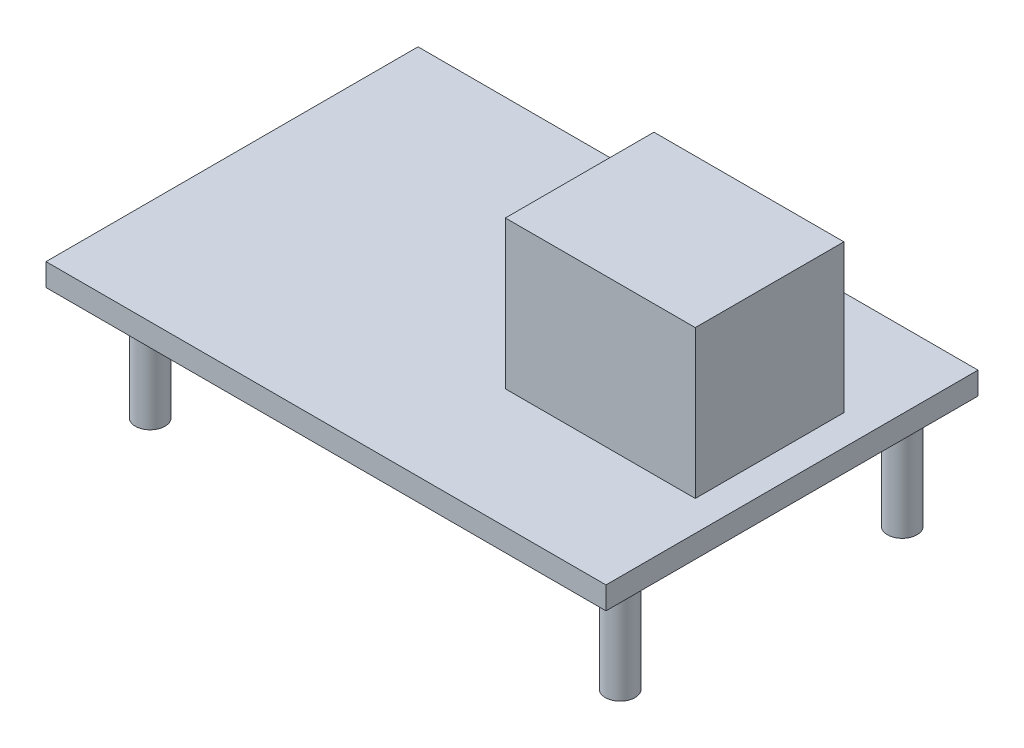
ISO-10303-21;
HEADER;
FILE_DESCRIPTION(('STEP AP214'),'2;1');
FILE_NAME('part.step','',(''),(''),'','','');
FILE_SCHEMA(('AUTOMOTIVE_DESIGN { 1 0 10303 214 1 1 1 1 }'));
ENDSEC;
DATA;
#1=APPLICATION_CONTEXT('core data for automotive mechanical design processes');
#2=APPLICATION_PROTOCOL_DEFINITION('international standard','automotive_design',2000,#1);
#3=PRODUCT_CONTEXT('',#1,'mechanical');
#4=PRODUCT('Part','Part','',(#3));
#5=PRODUCT_RELATED_PRODUCT_CATEGORY('part','',(#4));
#6=PRODUCT_DEFINITION_FORMATION('','',#4);
#7=PRODUCT_DEFINITION_CONTEXT('part definition',#1,'design');
#8=PRODUCT_DEFINITION('design','',#6,#7);
#9=PRODUCT_DEFINITION_SHAPE('','',#8);
#10=(LENGTH_UNIT() NAMED_UNIT(*) SI_UNIT(.MILLI.,.METRE.));
#11=(NAMED_UNIT(*) PLANE_ANGLE_UNIT() SI_UNIT($,.RADIAN.));
#12=(NAMED_UNIT(*) SI_UNIT($,.STERADIAN.) SOLID_ANGLE_UNIT());
#13=UNCERTAINTY_MEASURE_WITH_UNIT(LENGTH_MEASURE(1.E-05),#10,'distance_accuracy_value','');
#14=(GEOMETRIC_REPRESENTATION_CONTEXT(3) GLOBAL_UNCERTAINTY_ASSIGNED_CONTEXT((#13)) GLOBAL_UNIT_ASSIGNED_CONTEXT((#10,
#11,#12)) REPRESENTATION_CONTEXT('',''));
#15=CARTESIAN_POINT('',(0.,0.,0.));
#16=DIRECTION('',(0.,0.,1.));
#17=DIRECTION('',(1.,0.,0.));
#18=AXIS2_PLACEMENT_3D('',#15,#16,#17);
#19=CARTESIAN_POINT('',(0.,0.76,0.));
#20=DIRECTION('',(0.,1.,0.));
#21=DIRECTION('',(0.,0.,1.));
#22=AXIS2_PLACEMENT_3D('',#19,#20,#21);
#23=PLANE('',#22);
#24=DIRECTION('',(0.,0.,1.));
#25=VECTOR('',#24,1.);
#26=CARTESIAN_POINT('',(0.,0.76,0.));
#27=LINE('',#26,#25);
#28=CARTESIAN_POINT('',(0.,0.76,0.));
#29=VERTEX_POINT('',#28);
#30=CARTESIAN_POINT('',(0.,0.76,12.57));
#31=VERTEX_POINT('',#30);
#32=EDGE_CURVE('E155',#29,#31,#27,.T.);
#33=ORIENTED_EDGE('',*,*,#32,.T.);
#34=DIRECTION('',(1.,0.,0.));
#35=VECTOR('',#34,1.);
#36=CARTESIAN_POINT('',(0.,0.76,12.57));
#37=LINE('',#36,#35);
#38=CARTESIAN_POINT('',(18.92,0.76,12.57));
#39=VERTEX_POINT('',#38);
#40=EDGE_CURVE('E88',#31,#39,#37,.T.);
#41=ORIENTED_EDGE('',*,*,#40,.T.);
#42=DIRECTION('',(0.,0.,-1.));
#43=VECTOR('',#42,1.);
#44=CARTESIAN_POINT('',(18.92,0.76,0.));
#45=LINE('',#44,#43);
#46=CARTESIAN_POINT('',(18.92,0.76,0.));
#47=VERTEX_POINT('',#46);
#48=EDGE_CURVE('E158',#39,#47,#45,.T.);
#49=ORIENTED_EDGE('',*,*,#48,.T.);
#50=DIRECTION('',(-1.,0.,0.));
#51=VECTOR('',#50,1.);
#52=CARTESIAN_POINT('',(0.,0.76,0.));
#53=LINE('',#52,#51);
#54=EDGE_CURVE('E59',#47,#29,#53,.T.);
#55=ORIENTED_EDGE('',*,*,#54,.T.);
#56=EDGE_LOOP('',(#33,#41,#49,#55));
#57=FACE_BOUND('',#56,.T.);
#58=DIRECTION('',(-1.,0.,0.));
#59=VECTOR('',#58,1.);
#60=CARTESIAN_POINT('',(17.9,0.76,3.51216856732342));
#61=LINE('',#60,#59);
#62=CARTESIAN_POINT('',(17.9,0.76,3.51216856732342));
#63=VERTEX_POINT('',#62);
#64=CARTESIAN_POINT('',(11.483680484199,0.76,3.51216856732342));
#65=VERTEX_POINT('',#64);
#66=EDGE_CURVE('E405',#63,#65,#61,.T.);
#67=ORIENTED_EDGE('',*,*,#66,.F.);
#68=DIRECTION('',(0.,0.,-1.));
#69=VECTOR('',#68,1.);
#70=CARTESIAN_POINT('',(17.9,0.76,3.51216856732342));
#71=LINE('',#70,#69);
#72=CARTESIAN_POINT('',(17.9,0.76,8.53245284543258));
#73=VERTEX_POINT('',#72);
#74=EDGE_CURVE('E133',#73,#63,#71,.T.);
#75=ORIENTED_EDGE('',*,*,#74,.F.);
#76=DIRECTION('',(1.,0.,0.));
#77=VECTOR('',#76,1.);
#78=CARTESIAN_POINT('',(17.9,0.76,8.53245284543258));
#79=LINE('',#78,#77);
#80=CARTESIAN_POINT('',(11.483680484199,0.76,8.53245284543258));
#81=VERTEX_POINT('',#80);
#82=EDGE_CURVE('E129',#81,#73,#79,.T.);
#83=ORIENTED_EDGE('',*,*,#82,.F.);
#84=DIRECTION('',(0.,0.,1.));
#85=VECTOR('',#84,1.);
#86=CARTESIAN_POINT('',(11.483680484199,0.76,3.51216856732342));
#87=LINE('',#86,#85);
#88=EDGE_CURVE('E402',#65,#81,#87,.T.);
#89=ORIENTED_EDGE('',*,*,#88,.F.);
#90=EDGE_LOOP('',(#67,#75,#83,#89));
#91=FACE_BOUND('',#90,.T.);
#92=ADVANCED_FACE('F35',(#57,#91),#23,.T.);
#93=CARTESIAN_POINT('',(0.,0.76,0.));
#94=DIRECTION('',(1.,0.,0.));
#95=DIRECTION('',(0.,0.,-1.));
#96=AXIS2_PLACEMENT_3D('',#93,#94,#95);
#97=PLANE('',#96);
#98=DIRECTION('',(0.,0.,1.));
#99=VECTOR('',#98,1.);
#100=CARTESIAN_POINT('',(0.,0.,0.));
#101=LINE('',#100,#99);
#102=CARTESIAN_POINT('',(0.,0.,0.));
#103=VERTEX_POINT('',#102);
#104=CARTESIAN_POINT('',(0.,0.,12.57));
#105=VERTEX_POINT('',#104);
#106=EDGE_CURVE('E154',#103,#105,#101,.T.);
#107=ORIENTED_EDGE('',*,*,#106,.T.);
#108=DIRECTION('',(0.,-1.,0.));
#109=VECTOR('',#108,1.);
#110=CARTESIAN_POINT('',(0.,0.76,12.57));
#111=LINE('',#110,#109);
#112=EDGE_CURVE('E175',#31,#105,#111,.T.);
#113=ORIENTED_EDGE('',*,*,#112,.F.);
#114=ORIENTED_EDGE('',*,*,#32,.F.);
#115=DIRECTION('',(0.,-1.,0.));
#116=VECTOR('',#115,1.);
#117=CARTESIAN_POINT('',(0.,0.76,0.));
#118=LINE('',#117,#116);
#119=EDGE_CURVE('E161',#29,#103,#118,.T.);
#120=ORIENTED_EDGE('',*,*,#119,.T.);
#121=EDGE_LOOP('',(#107,#113,#114,#120));
#122=FACE_BOUND('',#121,.T.);
#123=ADVANCED_FACE('F37',(#122),#97,.F.);
#124=CARTESIAN_POINT('',(0.,0.76,12.57));
#125=DIRECTION('',(0.,0.,-1.));
#126=DIRECTION('',(-1.,0.,0.));
#127=AXIS2_PLACEMENT_3D('',#124,#125,#126);
#128=PLANE('',#127);
#129=DIRECTION('',(1.,0.,0.));
#130=VECTOR('',#129,1.);
#131=CARTESIAN_POINT('',(0.,0.,12.57));
#132=LINE('',#131,#130);
#133=CARTESIAN_POINT('',(18.92,0.,12.57));
#134=VERTEX_POINT('',#133);
#135=EDGE_CURVE('E164',#105,#134,#132,.T.);
#136=ORIENTED_EDGE('',*,*,#135,.T.);
#137=DIRECTION('',(0.,-1.,0.));
#138=VECTOR('',#137,1.);
#139=CARTESIAN_POINT('',(18.92,0.76,12.57));
#140=LINE('',#139,#138);
#141=EDGE_CURVE('E172',#39,#134,#140,.T.);
#142=ORIENTED_EDGE('',*,*,#141,.F.);
#143=ORIENTED_EDGE('',*,*,#40,.F.);
#144=ORIENTED_EDGE('',*,*,#112,.T.);
#145=EDGE_LOOP('',(#136,#142,#143,#144));
#146=FACE_BOUND('',#145,.T.);
#147=ADVANCED_FACE('F212',(#146),#128,.F.);
#148=CARTESIAN_POINT('',(18.92,0.76,0.));
#149=DIRECTION('',(-1.,0.,0.));
#150=DIRECTION('',(0.,0.,1.));
#151=AXIS2_PLACEMENT_3D('',#148,#149,#150);
#152=PLANE('',#151);
#153=DIRECTION('',(0.,0.,-1.));
#154=VECTOR('',#153,1.);
#155=CARTESIAN_POINT('',(18.92,0.,0.));
#156=LINE('',#155,#154);
#157=CARTESIAN_POINT('',(18.92,0.,0.));
#158=VERTEX_POINT('',#157);
#159=EDGE_CURVE('E166',#134,#158,#156,.T.);
#160=ORIENTED_EDGE('',*,*,#159,.T.);
#161=DIRECTION('',(0.,-1.,0.));
#162=VECTOR('',#161,1.);
#163=CARTESIAN_POINT('',(18.92,0.76,0.));
#164=LINE('',#163,#162);
#165=EDGE_CURVE('E170',#47,#158,#164,.T.);
#166=ORIENTED_EDGE('',*,*,#165,.F.);
#167=ORIENTED_EDGE('',*,*,#48,.F.);
#168=ORIENTED_EDGE('',*,*,#141,.T.);
#169=EDGE_LOOP('',(#160,#166,#167,#168));
#170=FACE_BOUND('',#169,.T.);
#171=ADVANCED_FACE('F211',(#170),#152,.F.);
#172=CARTESIAN_POINT('',(0.,0.76,0.));
#173=DIRECTION('',(0.,0.,1.));
#174=DIRECTION('',(1.,0.,0.));
#175=AXIS2_PLACEMENT_3D('',#172,#173,#174);
#176=PLANE('',#175);
#177=DIRECTION('',(-1.,0.,0.));
#178=VECTOR('',#177,1.);
#179=CARTESIAN_POINT('',(0.,0.,0.));
#180=LINE('',#179,#178);
#181=EDGE_CURVE('E80',#158,#103,#180,.T.);
#182=ORIENTED_EDGE('',*,*,#181,.T.);
#183=ORIENTED_EDGE('',*,*,#119,.F.);
#184=ORIENTED_EDGE('',*,*,#54,.F.);
#185=ORIENTED_EDGE('',*,*,#165,.T.);
#186=EDGE_LOOP('',(#182,#183,#184,#185));
#187=FACE_BOUND('',#186,.T.);
#188=ADVANCED_FACE('F194',(#187),#176,.F.);
#189=CARTESIAN_POINT('',(0.,0.,0.));
#190=DIRECTION('',(0.,1.,0.));
#191=DIRECTION('',(0.,0.,1.));
#192=AXIS2_PLACEMENT_3D('',#189,#190,#191);
#193=PLANE('',#192);
#194=CARTESIAN_POINT('',(17.9,0.,1.54));
#195=DIRECTION('',(0.,1.,0.));
#196=DIRECTION('',(0.,0.,1.));
#197=AXIS2_PLACEMENT_3D('',#194,#195,#196);
#198=CIRCLE('',#197,0.499999999999999);
#199=CARTESIAN_POINT('',(17.9,0.,2.04));
#200=VERTEX_POINT('',#199);
#201=EDGE_CURVE('E11',#200,#200,#198,.F.);
#202=ORIENTED_EDGE('',*,*,#201,.F.);
#203=EDGE_LOOP('',(#202));
#204=FACE_BOUND('',#203,.T.);
#205=CARTESIAN_POINT('',(2.02,0.,7.89));
#206=DIRECTION('',(0.,1.,0.));
#207=DIRECTION('',(0.,0.,1.));
#208=AXIS2_PLACEMENT_3D('',#205,#206,#207);
#209=CIRCLE('',#208,0.5);
#210=CARTESIAN_POINT('',(2.02,0.,8.39));
#211=VERTEX_POINT('',#210);
#212=EDGE_CURVE('E43',#211,#211,#209,.F.);
#213=ORIENTED_EDGE('',*,*,#212,.F.);
#214=EDGE_LOOP('',(#213));
#215=FACE_BOUND('',#214,.T.);
#216=CARTESIAN_POINT('',(2.02,0.,1.54));
#217=DIRECTION('',(0.,1.,0.));
#218=DIRECTION('',(0.,0.,1.));
#219=AXIS2_PLACEMENT_3D('',#216,#217,#218);
#220=CIRCLE('',#219,0.5);
#221=CARTESIAN_POINT('',(2.02,0.,2.04));
#222=VERTEX_POINT('',#221);
#223=EDGE_CURVE('E183',#222,#222,#220,.F.);
#224=ORIENTED_EDGE('',*,*,#223,.F.);
#225=EDGE_LOOP('',(#224));
#226=FACE_BOUND('',#225,.T.);
#227=CARTESIAN_POINT('',(17.9,0.,11.07));
#228=DIRECTION('',(0.,1.,0.));
#229=DIRECTION('',(0.,0.,1.));
#230=AXIS2_PLACEMENT_3D('',#227,#228,#229);
#231=CIRCLE('',#230,0.499999999999999);
#232=CARTESIAN_POINT('',(17.9,0.,11.57));
#233=VERTEX_POINT('',#232);
#234=EDGE_CURVE('E180',#233,#233,#231,.F.);
#235=ORIENTED_EDGE('',*,*,#234,.F.);
#236=EDGE_LOOP('',(#235));
#237=FACE_BOUND('',#236,.T.);
#238=CARTESIAN_POINT('',(2.02,0.,11.07));
#239=DIRECTION('',(0.,1.,0.));
#240=DIRECTION('',(0.,0.,1.));
#241=AXIS2_PLACEMENT_3D('',#238,#239,#240);
#242=CIRCLE('',#241,0.5);
#243=CARTESIAN_POINT('',(2.02,0.,11.57));
#244=VERTEX_POINT('',#243);
#245=EDGE_CURVE('E177',#244,#244,#242,.F.);
#246=ORIENTED_EDGE('',*,*,#245,.F.);
#247=EDGE_LOOP('',(#246));
#248=FACE_BOUND('',#247,.T.);
#249=ORIENTED_EDGE('',*,*,#106,.F.);
#250=ORIENTED_EDGE('',*,*,#181,.F.);
#251=ORIENTED_EDGE('',*,*,#159,.F.);
#252=ORIENTED_EDGE('',*,*,#135,.F.);
#253=EDGE_LOOP('',(#249,#250,#251,#252));
#254=FACE_BOUND('',#253,.T.);
#255=ADVANCED_FACE('F190',(#204,#215,#226,#237,#248,#254),#193,.F.);
#256=CARTESIAN_POINT('',(2.02,-3.55,11.07));
#257=DIRECTION('',(0.,1.,0.));
#258=DIRECTION('',(0.,0.,1.));
#259=AXIS2_PLACEMENT_3D('',#256,#257,#258);
#260=CYLINDRICAL_SURFACE('',#259,0.5);
#261=CARTESIAN_POINT('',(2.02,-3.55,11.07));
#262=DIRECTION('',(0.,-1.,0.));
#263=DIRECTION('',(0.,0.,-1.));
#264=AXIS2_PLACEMENT_3D('',#261,#262,#263);
#265=CIRCLE('',#264,0.5);
#266=CARTESIAN_POINT('',(2.02,-3.55,10.57));
#267=VERTEX_POINT('',#266);
#268=EDGE_CURVE('E151',#267,#267,#265,.T.);
#269=ORIENTED_EDGE('',*,*,#268,.F.);
#270=EDGE_LOOP('',(#269));
#271=FACE_BOUND('',#270,.T.);
#272=ORIENTED_EDGE('',*,*,#245,.T.);
#273=EDGE_LOOP('',(#272));
#274=FACE_BOUND('',#273,.T.);
#275=ADVANCED_FACE('F193',(#271,#274),#260,.T.);
#276=CARTESIAN_POINT('',(2.02,-3.55,11.07));
#277=DIRECTION('',(0.,-1.,0.));
#278=DIRECTION('',(0.,0.,-1.));
#279=AXIS2_PLACEMENT_3D('',#276,#277,#278);
#280=PLANE('',#279);
#281=ORIENTED_EDGE('',*,*,#268,.T.);
#282=EDGE_LOOP('',(#281));
#283=FACE_BOUND('',#282,.T.);
#284=ADVANCED_FACE('F242',(#283),#280,.T.);
#285=CARTESIAN_POINT('',(17.9,-3.55,11.07));
#286=DIRECTION('',(0.,1.,0.));
#287=DIRECTION('',(0.,0.,1.));
#288=AXIS2_PLACEMENT_3D('',#285,#286,#287);
#289=CYLINDRICAL_SURFACE('',#288,0.499999999999999);
#290=CARTESIAN_POINT('',(17.9,-3.55,11.07));
#291=DIRECTION('',(0.,-1.,0.));
#292=DIRECTION('',(0.,0.,-1.));
#293=AXIS2_PLACEMENT_3D('',#290,#291,#292);
#294=CIRCLE('',#293,0.499999999999999);
#295=CARTESIAN_POINT('',(17.9,-3.55,10.57));
#296=VERTEX_POINT('',#295);
#297=EDGE_CURVE('E148',#296,#296,#294,.T.);
#298=ORIENTED_EDGE('',*,*,#297,.F.);
#299=EDGE_LOOP('',(#298));
#300=FACE_BOUND('',#299,.T.);
#301=ORIENTED_EDGE('',*,*,#234,.T.);
#302=EDGE_LOOP('',(#301));
#303=FACE_BOUND('',#302,.T.);
#304=ADVANCED_FACE('F249',(#300,#303),#289,.T.);
#305=CARTESIAN_POINT('',(17.9,-3.55,11.07));
#306=DIRECTION('',(0.,-1.,0.));
#307=DIRECTION('',(0.,0.,-1.));
#308=AXIS2_PLACEMENT_3D('',#305,#306,#307);
#309=PLANE('',#308);
#310=ORIENTED_EDGE('',*,*,#297,.T.);
#311=EDGE_LOOP('',(#310));
#312=FACE_BOUND('',#311,.T.);
#313=ADVANCED_FACE('F256',(#312),#309,.T.);
#314=CARTESIAN_POINT('',(2.02,-3.55,1.54));
#315=DIRECTION('',(0.,1.,0.));
#316=DIRECTION('',(0.,0.,1.));
#317=AXIS2_PLACEMENT_3D('',#314,#315,#316);
#318=CYLINDRICAL_SURFACE('',#317,0.5);
#319=CARTESIAN_POINT('',(2.02,-3.55,1.54));
#320=DIRECTION('',(0.,-1.,0.));
#321=DIRECTION('',(0.,0.,-1.));
#322=AXIS2_PLACEMENT_3D('',#319,#320,#321);
#323=CIRCLE('',#322,0.5);
#324=CARTESIAN_POINT('',(2.02,-3.55,1.04));
#325=VERTEX_POINT('',#324);
#326=EDGE_CURVE('E145',#325,#325,#323,.T.);
#327=ORIENTED_EDGE('',*,*,#326,.F.);
#328=EDGE_LOOP('',(#327));
#329=FACE_BOUND('',#328,.T.);
#330=ORIENTED_EDGE('',*,*,#223,.T.);
#331=EDGE_LOOP('',(#330));
#332=FACE_BOUND('',#331,.T.);
#333=ADVANCED_FACE('F264',(#329,#332),#318,.T.);
#334=CARTESIAN_POINT('',(2.02,-3.55,1.54));
#335=DIRECTION('',(0.,-1.,0.));
#336=DIRECTION('',(0.,0.,-1.));
#337=AXIS2_PLACEMENT_3D('',#334,#335,#336);
#338=PLANE('',#337);
#339=ORIENTED_EDGE('',*,*,#326,.T.);
#340=EDGE_LOOP('',(#339));
#341=FACE_BOUND('',#340,.T.);
#342=ADVANCED_FACE('F272',(#341),#338,.T.);
#343=CARTESIAN_POINT('',(2.02,-3.55,7.89));
#344=DIRECTION('',(0.,1.,0.));
#345=DIRECTION('',(0.,0.,1.));
#346=AXIS2_PLACEMENT_3D('',#343,#344,#345);
#347=CYLINDRICAL_SURFACE('',#346,0.5);
#348=CARTESIAN_POINT('',(2.02,-3.55,7.89));
#349=DIRECTION('',(0.,-1.,0.));
#350=DIRECTION('',(0.,0.,-1.));
#351=AXIS2_PLACEMENT_3D('',#348,#349,#350);
#352=CIRCLE('',#351,0.5);
#353=CARTESIAN_POINT('',(2.02,-3.55,7.39));
#354=VERTEX_POINT('',#353);
#355=EDGE_CURVE('E138',#354,#354,#352,.T.);
#356=ORIENTED_EDGE('',*,*,#355,.F.);
#357=EDGE_LOOP('',(#356));
#358=FACE_BOUND('',#357,.T.);
#359=ORIENTED_EDGE('',*,*,#212,.T.);
#360=EDGE_LOOP('',(#359));
#361=FACE_BOUND('',#360,.T.);
#362=ADVANCED_FACE('F188',(#358,#361),#347,.T.);
#363=CARTESIAN_POINT('',(2.02,-3.55,7.89));
#364=DIRECTION('',(0.,-1.,0.));
#365=DIRECTION('',(0.,0.,-1.));
#366=AXIS2_PLACEMENT_3D('',#363,#364,#365);
#367=PLANE('',#366);
#368=ORIENTED_EDGE('',*,*,#355,.T.);
#369=EDGE_LOOP('',(#368));
#370=FACE_BOUND('',#369,.T.);
#371=ADVANCED_FACE('F287',(#370),#367,.T.);
#372=CARTESIAN_POINT('',(17.9,-3.55,1.54));
#373=DIRECTION('',(0.,1.,0.));
#374=DIRECTION('',(0.,0.,1.));
#375=AXIS2_PLACEMENT_3D('',#372,#373,#374);
#376=CYLINDRICAL_SURFACE('',#375,0.499999999999999);
#377=CARTESIAN_POINT('',(17.9,-3.55,1.54));
#378=DIRECTION('',(0.,-1.,0.));
#379=DIRECTION('',(0.,0.,-1.));
#380=AXIS2_PLACEMENT_3D('',#377,#378,#379);
#381=CIRCLE('',#380,0.499999999999999);
#382=CARTESIAN_POINT('',(17.9,-3.55,1.04));
#383=VERTEX_POINT('',#382);
#384=EDGE_CURVE('E135',#383,#383,#381,.T.);
#385=ORIENTED_EDGE('',*,*,#384,.F.);
#386=EDGE_LOOP('',(#385));
#387=FACE_BOUND('',#386,.T.);
#388=ORIENTED_EDGE('',*,*,#201,.T.);
#389=EDGE_LOOP('',(#388));
#390=FACE_BOUND('',#389,.T.);
#391=ADVANCED_FACE('F295',(#387,#390),#376,.T.);
#392=CARTESIAN_POINT('',(17.9,-3.55,1.54));
#393=DIRECTION('',(0.,-1.,0.));
#394=DIRECTION('',(0.,0.,-1.));
#395=AXIS2_PLACEMENT_3D('',#392,#393,#394);
#396=PLANE('',#395);
#397=ORIENTED_EDGE('',*,*,#384,.T.);
#398=EDGE_LOOP('',(#397));
#399=FACE_BOUND('',#398,.T.);
#400=ADVANCED_FACE('F303',(#399),#396,.T.);
#401=CARTESIAN_POINT('',(17.9,5.76,3.51216856732342));
#402=DIRECTION('',(-1.,0.,0.));
#403=DIRECTION('',(0.,0.,1.));
#404=AXIS2_PLACEMENT_3D('',#401,#402,#403);
#405=PLANE('',#404);
#406=ORIENTED_EDGE('',*,*,#74,.T.);
#407=DIRECTION('',(0.,-1.,0.));
#408=VECTOR('',#407,1.);
#409=CARTESIAN_POINT('',(17.9,5.76,3.51216856732342));
#410=LINE('',#409,#408);
#411=CARTESIAN_POINT('',(17.9,5.76,3.51216856732342));
#412=VERTEX_POINT('',#411);
#413=EDGE_CURVE('E114',#412,#63,#410,.T.);
#414=ORIENTED_EDGE('',*,*,#413,.F.);
#415=DIRECTION('',(0.,0.,-1.));
#416=VECTOR('',#415,1.);
#417=CARTESIAN_POINT('',(17.9,5.76,3.51216856732342));
#418=LINE('',#417,#416);
#419=CARTESIAN_POINT('',(17.9,5.76,8.53245284543258));
#420=VERTEX_POINT('',#419);
#421=EDGE_CURVE('E121',#420,#412,#418,.T.);
#422=ORIENTED_EDGE('',*,*,#421,.F.);
#423=DIRECTION('',(0.,-1.,0.));
#424=VECTOR('',#423,1.);
#425=CARTESIAN_POINT('',(17.9,5.76,8.53245284543258));
#426=LINE('',#425,#424);
#427=EDGE_CURVE('E400',#420,#73,#426,.T.);
#428=ORIENTED_EDGE('',*,*,#427,.T.);
#429=EDGE_LOOP('',(#406,#414,#422,#428));
#430=FACE_BOUND('',#429,.T.);
#431=ADVANCED_FACE('F131',(#430),#405,.F.);
#432=CARTESIAN_POINT('',(17.9,5.76,3.51216856732342));
#433=DIRECTION('',(0.,0.,1.));
#434=DIRECTION('',(1.,0.,0.));
#435=AXIS2_PLACEMENT_3D('',#432,#433,#434);
#436=PLANE('',#435);
#437=ORIENTED_EDGE('',*,*,#66,.T.);
#438=DIRECTION('',(0.,-1.,0.));
#439=VECTOR('',#438,1.);
#440=CARTESIAN_POINT('',(11.483680484199,5.76,3.51216856732342));
#441=LINE('',#440,#439);
#442=CARTESIAN_POINT('',(11.483680484199,5.76,3.51216856732342));
#443=VERTEX_POINT('',#442);
#444=EDGE_CURVE('E117',#443,#65,#441,.T.);
#445=ORIENTED_EDGE('',*,*,#444,.F.);
#446=DIRECTION('',(-1.,0.,0.));
#447=VECTOR('',#446,1.);
#448=CARTESIAN_POINT('',(17.9,5.76,3.51216856732342));
#449=LINE('',#448,#447);
#450=EDGE_CURVE('E110',#412,#443,#449,.T.);
#451=ORIENTED_EDGE('',*,*,#450,.F.);
#452=ORIENTED_EDGE('',*,*,#413,.T.);
#453=EDGE_LOOP('',(#437,#445,#451,#452));
#454=FACE_BOUND('',#453,.T.);
#455=ADVANCED_FACE('F112',(#454),#436,.F.);
#456=CARTESIAN_POINT('',(11.483680484199,5.76,3.51216856732342));
#457=DIRECTION('',(1.,0.,0.));
#458=DIRECTION('',(0.,0.,-1.));
#459=AXIS2_PLACEMENT_3D('',#456,#457,#458);
#460=PLANE('',#459);
#461=ORIENTED_EDGE('',*,*,#88,.T.);
#462=DIRECTION('',(0.,-1.,0.));
#463=VECTOR('',#462,1.);
#464=CARTESIAN_POINT('',(11.483680484199,5.76,8.53245284543258));
#465=LINE('',#464,#463);
#466=CARTESIAN_POINT('',(11.483680484199,5.76,8.53245284543258));
#467=VERTEX_POINT('',#466);
#468=EDGE_CURVE('E50',#467,#81,#465,.T.);
#469=ORIENTED_EDGE('',*,*,#468,.F.);
#470=DIRECTION('',(0.,0.,1.));
#471=VECTOR('',#470,1.);
#472=CARTESIAN_POINT('',(11.483680484199,5.76,3.51216856732342));
#473=LINE('',#472,#471);
#474=EDGE_CURVE('E120',#443,#467,#473,.T.);
#475=ORIENTED_EDGE('',*,*,#474,.F.);
#476=ORIENTED_EDGE('',*,*,#444,.T.);
#477=EDGE_LOOP('',(#461,#469,#475,#476));
#478=FACE_BOUND('',#477,.T.);
#479=ADVANCED_FACE('F324',(#478),#460,.F.);
#480=CARTESIAN_POINT('',(17.9,5.76,8.53245284543258));
#481=DIRECTION('',(0.,0.,-1.));
#482=DIRECTION('',(-1.,0.,0.));
#483=AXIS2_PLACEMENT_3D('',#480,#481,#482);
#484=PLANE('',#483);
#485=ORIENTED_EDGE('',*,*,#82,.T.);
#486=ORIENTED_EDGE('',*,*,#427,.F.);
#487=DIRECTION('',(1.,0.,0.));
#488=VECTOR('',#487,1.);
#489=CARTESIAN_POINT('',(17.9,5.76,8.53245284543258));
#490=LINE('',#489,#488);
#491=EDGE_CURVE('E125',#467,#420,#490,.T.);
#492=ORIENTED_EDGE('',*,*,#491,.F.);
#493=ORIENTED_EDGE('',*,*,#468,.T.);
#494=EDGE_LOOP('',(#485,#486,#492,#493));
#495=FACE_BOUND('',#494,.T.);
#496=ADVANCED_FACE('F331',(#495),#484,.F.);
#497=CARTESIAN_POINT('',(0.,5.76,0.));
#498=DIRECTION('',(0.,-1.,0.));
#499=DIRECTION('',(0.,0.,-1.));
#500=AXIS2_PLACEMENT_3D('',#497,#498,#499);
#501=PLANE('',#500);
#502=ORIENTED_EDGE('',*,*,#421,.T.);
#503=ORIENTED_EDGE('',*,*,#450,.T.);
#504=ORIENTED_EDGE('',*,*,#474,.T.);
#505=ORIENTED_EDGE('',*,*,#491,.T.);
#506=EDGE_LOOP('',(#502,#503,#504,#505));
#507=FACE_BOUND('',#506,.T.);
#508=ADVANCED_FACE('F124',(#507),#501,.F.);
#509=CLOSED_SHELL('',(#92,#123,#147,#171,#188,#255,#275,#284,#304,#313,#333,#342,#362,#371,#391,
#400,#431,#455,#479,#496,#508));
#510=MANIFOLD_SOLID_BREP('B2',#509);
#511=ADVANCED_BREP_SHAPE_REPRESENTATION('',(#18,#510),#14);
#512=SHAPE_DEFINITION_REPRESENTATION(#9,#511);
ENDSEC;
END-ISO-10303-21;
